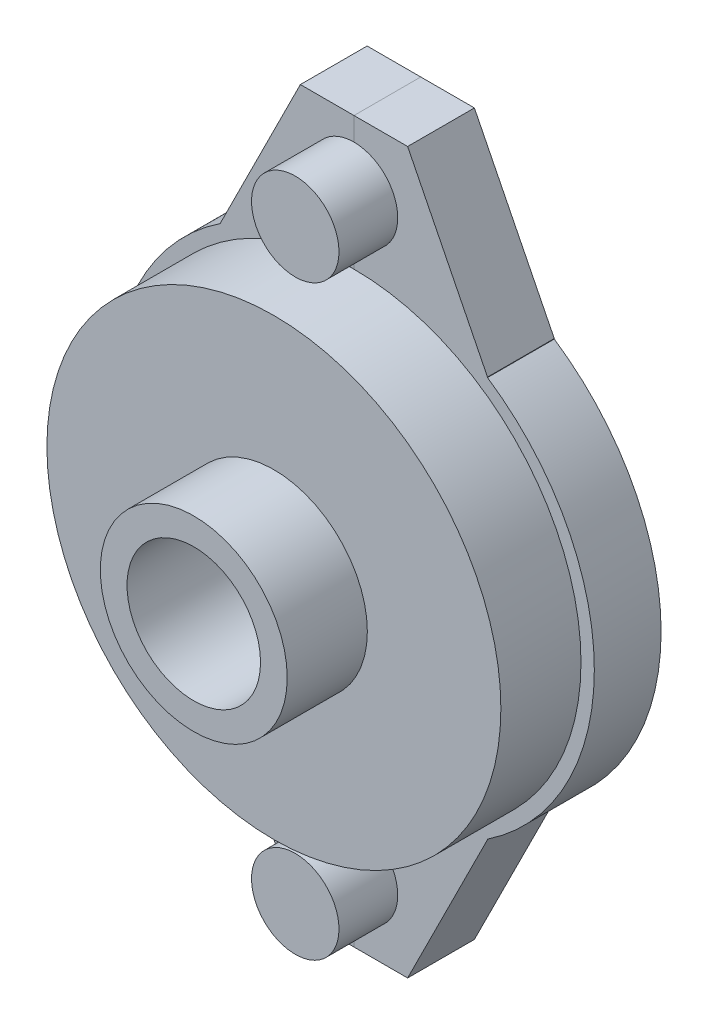
ISO-10303-21;
HEADER;
FILE_DESCRIPTION(('STEP AP214'),'2;1');
FILE_NAME('part.step','',(''),(''),'','','');
FILE_SCHEMA(('AUTOMOTIVE_DESIGN { 1 0 10303 214 1 1 1 1 }'));
ENDSEC;
DATA;
#1=APPLICATION_CONTEXT('core data for automotive mechanical design processes');
#2=APPLICATION_PROTOCOL_DEFINITION('international standard','automotive_design',2000,#1);
#3=PRODUCT_CONTEXT('',#1,'mechanical');
#4=PRODUCT('Part','Part','',(#3));
#5=PRODUCT_RELATED_PRODUCT_CATEGORY('part','',(#4));
#6=PRODUCT_DEFINITION_FORMATION('','',#4);
#7=PRODUCT_DEFINITION_CONTEXT('part definition',#1,'design');
#8=PRODUCT_DEFINITION('design','',#6,#7);
#9=PRODUCT_DEFINITION_SHAPE('','',#8);
#10=(LENGTH_UNIT() NAMED_UNIT(*) SI_UNIT(.MILLI.,.METRE.));
#11=(NAMED_UNIT(*) PLANE_ANGLE_UNIT() SI_UNIT($,.RADIAN.));
#12=(NAMED_UNIT(*) SI_UNIT($,.STERADIAN.) SOLID_ANGLE_UNIT());
#13=UNCERTAINTY_MEASURE_WITH_UNIT(LENGTH_MEASURE(1.E-05),#10,'distance_accuracy_value','');
#14=(GEOMETRIC_REPRESENTATION_CONTEXT(3) GLOBAL_UNCERTAINTY_ASSIGNED_CONTEXT((#13)) GLOBAL_UNIT_ASSIGNED_CONTEXT((#10,
#11,#12)) REPRESENTATION_CONTEXT('',''));
#15=CARTESIAN_POINT('',(0.,0.,0.));
#16=DIRECTION('',(0.,0.,1.));
#17=DIRECTION('',(1.,0.,0.));
#18=AXIS2_PLACEMENT_3D('',#15,#16,#17);
#19=CARTESIAN_POINT('',(10.,26.9666295470958,0.));
#20=DIRECTION('',(0.,1.,0.));
#21=DIRECTION('',(0.,0.,1.));
#22=AXIS2_PLACEMENT_3D('',#19,#20,#21);
#23=PLANE('',#22);
#24=DIRECTION('',(1.,0.,0.));
#25=VECTOR('',#24,1.);
#26=CARTESIAN_POINT('',(10.,26.9666295470958,0.));
#27=LINE('',#26,#25);
#28=CARTESIAN_POINT('',(-4.01668522645212,26.9666295470958,0.));
#29=VERTEX_POINT('',#28);
#30=CARTESIAN_POINT('',(0.,26.9666295470958,0.));
#31=VERTEX_POINT('',#30);
#32=EDGE_CURVE('E249',#29,#31,#27,.T.);
#33=ORIENTED_EDGE('',*,*,#32,.T.);
#34=DIRECTION('',(0.,0.,-1.));
#35=VECTOR('',#34,1.);
#36=CARTESIAN_POINT('',(0.,26.9666295470958,0.));
#37=LINE('',#36,#35);
#38=CARTESIAN_POINT('',(0.,26.9666295470958,-5.));
#39=VERTEX_POINT('',#38);
#40=EDGE_CURVE('E12',#31,#39,#37,.T.);
#41=ORIENTED_EDGE('',*,*,#40,.T.);
#42=DIRECTION('',(1.,0.,0.));
#43=VECTOR('',#42,1.);
#44=CARTESIAN_POINT('',(10.,26.9666295470958,-5.));
#45=LINE('',#44,#43);
#46=CARTESIAN_POINT('',(-4.01668522645211,26.9666295470958,-5.));
#47=VERTEX_POINT('',#46);
#48=EDGE_CURVE('E260',#47,#39,#45,.T.);
#49=ORIENTED_EDGE('',*,*,#48,.F.);
#50=DIRECTION('',(0.,0.,-1.));
#51=VECTOR('',#50,1.);
#52=CARTESIAN_POINT('',(-4.01668522645211,26.9666295470958,0.));
#53=LINE('',#52,#51);
#54=EDGE_CURVE('E226',#29,#47,#53,.T.);
#55=ORIENTED_EDGE('',*,*,#54,.F.);
#56=EDGE_LOOP('',(#33,#41,#49,#55));
#57=FACE_BOUND('',#56,.T.);
#58=ADVANCED_FACE('F45',(#57),#23,.T.);
#59=CARTESIAN_POINT('',(10.,-26.9666295470958,0.));
#60=DIRECTION('',(0.,1.,0.));
#61=DIRECTION('',(0.,0.,1.));
#62=AXIS2_PLACEMENT_3D('',#59,#60,#61);
#63=PLANE('',#62);
#64=DIRECTION('',(1.,0.,0.));
#65=VECTOR('',#64,1.);
#66=CARTESIAN_POINT('',(10.,-26.9666295470958,0.));
#67=LINE('',#66,#65);
#68=CARTESIAN_POINT('',(0.,-26.9666295470958,0.));
#69=VERTEX_POINT('',#68);
#70=CARTESIAN_POINT('',(4.01668522645212,-26.9666295470958,0.));
#71=VERTEX_POINT('',#70);
#72=EDGE_CURVE('E200',#69,#71,#67,.T.);
#73=ORIENTED_EDGE('',*,*,#72,.F.);
#74=DIRECTION('',(0.,0.,-1.));
#75=VECTOR('',#74,1.);
#76=CARTESIAN_POINT('',(0.,-26.9666295470958,0.));
#77=LINE('',#76,#75);
#78=CARTESIAN_POINT('',(0.,-26.9666295470958,-5.));
#79=VERTEX_POINT('',#78);
#80=EDGE_CURVE('E54',#69,#79,#77,.T.);
#81=ORIENTED_EDGE('',*,*,#80,.T.);
#82=DIRECTION('',(1.,0.,0.));
#83=VECTOR('',#82,1.);
#84=CARTESIAN_POINT('',(10.,-26.9666295470958,-5.));
#85=LINE('',#84,#83);
#86=CARTESIAN_POINT('',(4.01668522645212,-26.9666295470958,-5.));
#87=VERTEX_POINT('',#86);
#88=EDGE_CURVE('E207',#79,#87,#85,.T.);
#89=ORIENTED_EDGE('',*,*,#88,.T.);
#90=DIRECTION('',(0.,0.,-1.));
#91=VECTOR('',#90,1.);
#92=CARTESIAN_POINT('',(4.01668522645212,-26.9666295470958,0.));
#93=LINE('',#92,#91);
#94=EDGE_CURVE('E185',#71,#87,#93,.T.);
#95=ORIENTED_EDGE('',*,*,#94,.F.);
#96=EDGE_LOOP('',(#73,#81,#89,#95));
#97=FACE_BOUND('',#96,.T.);
#98=ADVANCED_FACE('F383',(#97),#63,.F.);
#99=CARTESIAN_POINT('',(0.,0.,0.));
#100=DIRECTION('',(0.,0.,-1.));
#101=DIRECTION('',(-1.,0.,0.));
#102=AXIS2_PLACEMENT_3D('',#99,#100,#101);
#103=PLANE('',#102);
#104=CARTESIAN_POINT('',(0.,-21.9666295470958,0.));
#105=DIRECTION('',(0.,0.,-1.));
#106=DIRECTION('',(1.,0.,0.));
#107=AXIS2_PLACEMENT_3D('',#104,#105,#106);
#108=CIRCLE('',#107,3.275);
#109=CARTESIAN_POINT('',(0.,-18.6916295470958,0.));
#110=VERTEX_POINT('',#109);
#111=CARTESIAN_POINT('',(0.,-25.2416295470958,0.));
#112=VERTEX_POINT('',#111);
#113=EDGE_CURVE('E499',#110,#112,#108,.T.);
#114=ORIENTED_EDGE('',*,*,#113,.T.);
#115=DIRECTION('',(0.,-1.,0.));
#116=VECTOR('',#115,1.);
#117=CARTESIAN_POINT('',(0.,0.,0.));
#118=LINE('',#117,#116);
#119=EDGE_CURVE('E328',#112,#69,#118,.T.);
#120=ORIENTED_EDGE('',*,*,#119,.T.);
#121=ORIENTED_EDGE('',*,*,#72,.T.);
#122=DIRECTION('',(0.447213595499958,0.894427190999916,0.));
#123=VECTOR('',#122,1.);
#124=CARTESIAN_POINT('',(10.,-15.,0.));
#125=LINE('',#124,#123);
#126=CARTESIAN_POINT('',(10.,-15.,0.));
#127=VERTEX_POINT('',#126);
#128=EDGE_CURVE('E174',#71,#127,#125,.T.);
#129=ORIENTED_EDGE('',*,*,#128,.T.);
#130=DIRECTION('',(0.,1.,0.));
#131=VECTOR('',#130,1.);
#132=CARTESIAN_POINT('',(10.,-14.9666295470958,0.));
#133=LINE('',#132,#131);
#134=CARTESIAN_POINT('',(10.,-14.9666295470958,0.));
#135=VERTEX_POINT('',#134);
#136=EDGE_CURVE('E215',#127,#135,#133,.T.);
#137=ORIENTED_EDGE('',*,*,#136,.T.);
#138=CARTESIAN_POINT('',(0.,0.,0.));
#139=DIRECTION('',(0.,0.,-1.));
#140=DIRECTION('',(-1.,0.,0.));
#141=AXIS2_PLACEMENT_3D('',#138,#139,#140);
#142=CIRCLE('',#141,18.);
#143=CARTESIAN_POINT('',(10.,14.9666295470958,0.));
#144=VERTEX_POINT('',#143);
#145=EDGE_CURVE('E279',#144,#135,#142,.T.);
#146=ORIENTED_EDGE('',*,*,#145,.F.);
#147=DIRECTION('',(0.,-1.,0.));
#148=VECTOR('',#147,1.);
#149=CARTESIAN_POINT('',(10.,14.9666295470958,0.));
#150=LINE('',#149,#148);
#151=CARTESIAN_POINT('',(10.,15.,0.));
#152=VERTEX_POINT('',#151);
#153=EDGE_CURVE('E252',#152,#144,#150,.T.);
#154=ORIENTED_EDGE('',*,*,#153,.F.);
#155=DIRECTION('',(0.447213595499958,-0.894427190999916,0.));
#156=VECTOR('',#155,1.);
#157=CARTESIAN_POINT('',(10.,15.,0.));
#158=LINE('',#157,#156);
#159=CARTESIAN_POINT('',(4.01668522645212,26.9666295470958,0.));
#160=VERTEX_POINT('',#159);
#161=EDGE_CURVE('E227',#160,#152,#158,.T.);
#162=ORIENTED_EDGE('',*,*,#161,.F.);
#163=EDGE_CURVE('E247',#31,#160,#27,.T.);
#164=ORIENTED_EDGE('',*,*,#163,.F.);
#165=DIRECTION('',(0.,-1.,0.));
#166=VECTOR('',#165,1.);
#167=CARTESIAN_POINT('',(0.,0.,0.));
#168=LINE('',#167,#166);
#169=CARTESIAN_POINT('',(0.,25.2416295470958,0.));
#170=VERTEX_POINT('',#169);
#171=EDGE_CURVE('E316',#31,#170,#168,.T.);
#172=ORIENTED_EDGE('',*,*,#171,.T.);
#173=CARTESIAN_POINT('',(0.,21.9666295470958,0.));
#174=DIRECTION('',(0.,0.,-1.));
#175=DIRECTION('',(-1.,0.,0.));
#176=AXIS2_PLACEMENT_3D('',#173,#174,#175);
#177=CIRCLE('',#176,3.275);
#178=CARTESIAN_POINT('',(0.,18.6916295470958,0.));
#179=VERTEX_POINT('',#178);
#180=EDGE_CURVE('E306',#179,#170,#177,.F.);
#181=ORIENTED_EDGE('',*,*,#180,.F.);
#182=DIRECTION('',(0.,-1.,0.));
#183=VECTOR('',#182,1.);
#184=CARTESIAN_POINT('',(0.,0.,0.));
#185=LINE('',#184,#183);
#186=CARTESIAN_POINT('',(0.,17.,0.));
#187=VERTEX_POINT('',#186);
#188=EDGE_CURVE('E320',#179,#187,#185,.T.);
#189=ORIENTED_EDGE('',*,*,#188,.T.);
#190=CARTESIAN_POINT('',(0.,0.,0.));
#191=DIRECTION('',(0.,0.,1.));
#192=DIRECTION('',(1.,0.,0.));
#193=AXIS2_PLACEMENT_3D('',#190,#191,#192);
#194=CIRCLE('',#193,17.);
#195=CARTESIAN_POINT('',(0.,-17.,0.));
#196=VERTEX_POINT('',#195);
#197=EDGE_CURVE('E277',#196,#187,#194,.T.);
#198=ORIENTED_EDGE('',*,*,#197,.F.);
#199=DIRECTION('',(0.,-1.,0.));
#200=VECTOR('',#199,1.);
#201=CARTESIAN_POINT('',(0.,0.,0.));
#202=LINE('',#201,#200);
#203=EDGE_CURVE('E324',#196,#110,#202,.T.);
#204=ORIENTED_EDGE('',*,*,#203,.T.);
#205=EDGE_LOOP('',(#114,#120,#121,#129,#137,#146,#154,#162,#164,#172,#181,#189,#198,#204));
#206=FACE_BOUND('',#205,.T.);
#207=ADVANCED_FACE('F354',(#206),#103,.F.);
#208=CARTESIAN_POINT('',(0.,0.,-5.));
#209=DIRECTION('',(0.,0.,1.));
#210=DIRECTION('',(1.,0.,0.));
#211=AXIS2_PLACEMENT_3D('',#208,#209,#210);
#212=CYLINDRICAL_SURFACE('',#211,5.);
#213=CARTESIAN_POINT('',(0.,0.,12.));
#214=DIRECTION('',(0.,0.,1.));
#215=DIRECTION('',(1.,0.,0.));
#216=AXIS2_PLACEMENT_3D('',#213,#214,#215);
#217=CIRCLE('',#216,5.);
#218=CARTESIAN_POINT('',(5.,0.,12.));
#219=VERTEX_POINT('',#218);
#220=EDGE_CURVE('E487',#219,#219,#217,.T.);
#221=ORIENTED_EDGE('',*,*,#220,.T.);
#222=EDGE_LOOP('',(#221));
#223=FACE_BOUND('',#222,.T.);
#224=CARTESIAN_POINT('',(0.,0.,-2.2));
#225=DIRECTION('',(0.,0.,-1.));
#226=DIRECTION('',(-1.,0.,0.));
#227=AXIS2_PLACEMENT_3D('',#224,#225,#226);
#228=CIRCLE('',#227,5.);
#229=CARTESIAN_POINT('',(-5.,0.,-2.2));
#230=VERTEX_POINT('',#229);
#231=EDGE_CURVE('E471',#230,#230,#228,.F.);
#232=ORIENTED_EDGE('',*,*,#231,.F.);
#233=EDGE_LOOP('',(#232));
#234=FACE_BOUND('',#233,.T.);
#235=ADVANCED_FACE('F444',(#223,#234),#212,.F.);
#236=CARTESIAN_POINT('',(0.,0.,-2.));
#237=DIRECTION('',(0.,0.,-1.));
#238=DIRECTION('',(-1.,0.,0.));
#239=AXIS2_PLACEMENT_3D('',#236,#237,#238);
#240=CYLINDRICAL_SURFACE('',#239,8.6);
#241=CARTESIAN_POINT('',(0.,0.,-2.));
#242=DIRECTION('',(0.,0.,-1.));
#243=DIRECTION('',(-1.,0.,0.));
#244=AXIS2_PLACEMENT_3D('',#241,#242,#243);
#245=CIRCLE('',#244,8.6);
#246=CARTESIAN_POINT('',(-8.6,0.,-2.));
#247=VERTEX_POINT('',#246);
#248=EDGE_CURVE('E474',#247,#247,#245,.T.);
#249=ORIENTED_EDGE('',*,*,#248,.T.);
#250=EDGE_LOOP('',(#249));
#251=FACE_BOUND('',#250,.T.);
#252=CARTESIAN_POINT('',(0.,0.,-2.2));
#253=DIRECTION('',(0.,0.,-1.));
#254=DIRECTION('',(-1.,0.,0.));
#255=AXIS2_PLACEMENT_3D('',#252,#253,#254);
#256=CIRCLE('',#255,8.6);
#257=CARTESIAN_POINT('',(-8.6,0.,-2.2));
#258=VERTEX_POINT('',#257);
#259=EDGE_CURVE('E468',#258,#258,#256,.T.);
#260=ORIENTED_EDGE('',*,*,#259,.F.);
#261=EDGE_LOOP('',(#260));
#262=FACE_BOUND('',#261,.T.);
#263=ADVANCED_FACE('F447',(#251,#262),#240,.T.);
#264=CARTESIAN_POINT('',(0.,0.,-5.));
#265=DIRECTION('',(0.,0.,-1.));
#266=DIRECTION('',(-1.,0.,0.));
#267=AXIS2_PLACEMENT_3D('',#264,#265,#266);
#268=PLANE('',#267);
#269=CARTESIAN_POINT('',(0.,0.,-5.));
#270=DIRECTION('',(0.,0.,-1.));
#271=DIRECTION('',(-1.,0.,0.));
#272=AXIS2_PLACEMENT_3D('',#269,#270,#271);
#273=CIRCLE('',#272,13.6);
#274=CARTESIAN_POINT('',(-13.6,0.,-5.));
#275=VERTEX_POINT('',#274);
#276=EDGE_CURVE('E479',#275,#275,#273,.T.);
#277=ORIENTED_EDGE('',*,*,#276,.F.);
#278=EDGE_LOOP('',(#277));
#279=FACE_BOUND('',#278,.T.);
#280=CARTESIAN_POINT('',(-4.01668522645211,-26.9666295470958,-5.));
#281=VERTEX_POINT('',#280);
#282=EDGE_CURVE('E209',#281,#79,#85,.T.);
#283=ORIENTED_EDGE('',*,*,#282,.F.);
#284=DIRECTION('',(-0.447213595499958,0.894427190999916,0.));
#285=VECTOR('',#284,1.);
#286=CARTESIAN_POINT('',(-14.,-7.,-5.));
#287=LINE('',#286,#285);
#288=CARTESIAN_POINT('',(-10.,-15.,-5.));
#289=VERTEX_POINT('',#288);
#290=EDGE_CURVE('E208',#281,#289,#287,.T.);
#291=ORIENTED_EDGE('',*,*,#290,.T.);
#292=DIRECTION('',(0.,-1.,0.));
#293=VECTOR('',#292,1.);
#294=CARTESIAN_POINT('',(-10.,-26.9666295470958,-5.));
#295=LINE('',#294,#293);
#296=CARTESIAN_POINT('',(-10.,-14.9666295470958,-5.));
#297=VERTEX_POINT('',#296);
#298=EDGE_CURVE('E183',#297,#289,#295,.T.);
#299=ORIENTED_EDGE('',*,*,#298,.F.);
#300=CARTESIAN_POINT('',(0.,0.,-5.));
#301=DIRECTION('',(0.,0.,-1.));
#302=DIRECTION('',(-1.,0.,0.));
#303=AXIS2_PLACEMENT_3D('',#300,#301,#302);
#304=CIRCLE('',#303,18.);
#305=CARTESIAN_POINT('',(-10.,14.9666295470958,-5.));
#306=VERTEX_POINT('',#305);
#307=EDGE_CURVE('E278',#297,#306,#304,.T.);
#308=ORIENTED_EDGE('',*,*,#307,.T.);
#309=DIRECTION('',(0.,1.,0.));
#310=VECTOR('',#309,1.);
#311=CARTESIAN_POINT('',(-10.,26.9666295470958,-5.));
#312=LINE('',#311,#310);
#313=CARTESIAN_POINT('',(-10.,15.,-5.));
#314=VERTEX_POINT('',#313);
#315=EDGE_CURVE('E242',#306,#314,#312,.T.);
#316=ORIENTED_EDGE('',*,*,#315,.T.);
#317=DIRECTION('',(-0.447213595499958,-0.894427190999916,0.));
#318=VECTOR('',#317,1.);
#319=CARTESIAN_POINT('',(-14.,7.,-5.));
#320=LINE('',#319,#318);
#321=EDGE_CURVE('E235',#47,#314,#320,.T.);
#322=ORIENTED_EDGE('',*,*,#321,.F.);
#323=ORIENTED_EDGE('',*,*,#48,.T.);
#324=CARTESIAN_POINT('',(4.01668522645212,26.9666295470958,-5.));
#325=VERTEX_POINT('',#324);
#326=EDGE_CURVE('E259',#39,#325,#45,.T.);
#327=ORIENTED_EDGE('',*,*,#326,.T.);
#328=DIRECTION('',(-0.447213595499958,0.894427190999916,0.));
#329=VECTOR('',#328,1.);
#330=CARTESIAN_POINT('',(14.,7.,-5.));
#331=LINE('',#330,#329);
#332=CARTESIAN_POINT('',(10.,15.,-5.));
#333=VERTEX_POINT('',#332);
#334=EDGE_CURVE('E238',#333,#325,#331,.T.);
#335=ORIENTED_EDGE('',*,*,#334,.F.);
#336=DIRECTION('',(0.,-1.,0.));
#337=VECTOR('',#336,1.);
#338=CARTESIAN_POINT('',(10.,14.9666295470958,-5.));
#339=LINE('',#338,#337);
#340=CARTESIAN_POINT('',(10.,14.9666295470958,-5.));
#341=VERTEX_POINT('',#340);
#342=EDGE_CURVE('E248',#333,#341,#339,.T.);
#343=ORIENTED_EDGE('',*,*,#342,.T.);
#344=CARTESIAN_POINT('',(10.,-14.9666295470958,-5.));
#345=VERTEX_POINT('',#344);
#346=EDGE_CURVE('E273',#341,#345,#304,.T.);
#347=ORIENTED_EDGE('',*,*,#346,.T.);
#348=DIRECTION('',(0.,1.,0.));
#349=VECTOR('',#348,1.);
#350=CARTESIAN_POINT('',(10.,-14.9666295470958,-5.));
#351=LINE('',#350,#349);
#352=CARTESIAN_POINT('',(10.,-15.,-5.));
#353=VERTEX_POINT('',#352);
#354=EDGE_CURVE('E204',#353,#345,#351,.T.);
#355=ORIENTED_EDGE('',*,*,#354,.F.);
#356=DIRECTION('',(-0.447213595499958,-0.894427190999916,0.));
#357=VECTOR('',#356,1.);
#358=CARTESIAN_POINT('',(14.,-7.,-5.));
#359=LINE('',#358,#357);
#360=EDGE_CURVE('E508',#353,#87,#359,.T.);
#361=ORIENTED_EDGE('',*,*,#360,.T.);
#362=ORIENTED_EDGE('',*,*,#88,.F.);
#363=EDGE_LOOP('',(#283,#291,#299,#308,#316,#322,#323,#327,#335,#343,#347,#355,#361,#362));
#364=FACE_BOUND('',#363,.T.);
#365=ADVANCED_FACE('F341',(#279,#364),#268,.T.);
#366=ORIENTED_EDGE('',*,*,#119,.F.);
#367=EDGE_CURVE('E494',#112,#110,#108,.T.);
#368=ORIENTED_EDGE('',*,*,#367,.T.);
#369=ORIENTED_EDGE('',*,*,#203,.F.);
#370=EDGE_CURVE('E288',#187,#196,#194,.T.);
#371=ORIENTED_EDGE('',*,*,#370,.F.);
#372=ORIENTED_EDGE('',*,*,#188,.F.);
#373=EDGE_CURVE('E307',#170,#179,#177,.F.);
#374=ORIENTED_EDGE('',*,*,#373,.F.);
#375=ORIENTED_EDGE('',*,*,#171,.F.);
#376=ORIENTED_EDGE('',*,*,#32,.F.);
#377=DIRECTION('',(0.447213595499958,0.894427190999916,0.));
#378=VECTOR('',#377,1.);
#379=CARTESIAN_POINT('',(-10.,15.,0.));
#380=LINE('',#379,#378);
#381=CARTESIAN_POINT('',(-10.,15.,0.));
#382=VERTEX_POINT('',#381);
#383=EDGE_CURVE('E223',#382,#29,#380,.T.);
#384=ORIENTED_EDGE('',*,*,#383,.F.);
#385=DIRECTION('',(0.,1.,0.));
#386=VECTOR('',#385,1.);
#387=CARTESIAN_POINT('',(-10.,26.9666295470958,0.));
#388=LINE('',#387,#386);
#389=CARTESIAN_POINT('',(-10.,14.9666295470958,0.));
#390=VERTEX_POINT('',#389);
#391=EDGE_CURVE('E243',#390,#382,#388,.T.);
#392=ORIENTED_EDGE('',*,*,#391,.F.);
#393=CARTESIAN_POINT('',(-10.,-14.9666295470958,0.));
#394=VERTEX_POINT('',#393);
#395=EDGE_CURVE('E189',#394,#390,#142,.T.);
#396=ORIENTED_EDGE('',*,*,#395,.F.);
#397=DIRECTION('',(0.,-1.,0.));
#398=VECTOR('',#397,1.);
#399=CARTESIAN_POINT('',(-10.,-26.9666295470958,0.));
#400=LINE('',#399,#398);
#401=CARTESIAN_POINT('',(-10.,-15.,0.));
#402=VERTEX_POINT('',#401);
#403=EDGE_CURVE('E181',#394,#402,#400,.T.);
#404=ORIENTED_EDGE('',*,*,#403,.T.);
#405=DIRECTION('',(0.447213595499958,-0.894427190999916,0.));
#406=VECTOR('',#405,1.);
#407=CARTESIAN_POINT('',(-10.,-15.,0.));
#408=LINE('',#407,#406);
#409=CARTESIAN_POINT('',(-4.01668522645212,-26.9666295470958,0.));
#410=VERTEX_POINT('',#409);
#411=EDGE_CURVE('E162',#402,#410,#408,.T.);
#412=ORIENTED_EDGE('',*,*,#411,.T.);
#413=EDGE_CURVE('E193',#410,#69,#67,.T.);
#414=ORIENTED_EDGE('',*,*,#413,.T.);
#415=EDGE_LOOP('',(#366,#368,#369,#371,#372,#374,#375,#376,#384,#392,#396,#404,#412,#414));
#416=FACE_BOUND('',#415,.T.);
#417=ADVANCED_FACE('F187',(#416),#103,.F.);
#418=CARTESIAN_POINT('',(-10.,-26.9666295470958,0.));
#419=DIRECTION('',(1.,0.,0.));
#420=DIRECTION('',(0.,0.,-1.));
#421=AXIS2_PLACEMENT_3D('',#418,#419,#420);
#422=PLANE('',#421);
#423=DIRECTION('',(0.,0.,1.));
#424=VECTOR('',#423,1.);
#425=CARTESIAN_POINT('',(-10.,-15.,-8.));
#426=LINE('',#425,#424);
#427=EDGE_CURVE('E165',#289,#402,#426,.T.);
#428=ORIENTED_EDGE('',*,*,#427,.T.);
#429=ORIENTED_EDGE('',*,*,#403,.F.);
#430=DIRECTION('',(0.,0.,-1.));
#431=VECTOR('',#430,1.);
#432=CARTESIAN_POINT('',(-10.,-14.9666295470958,0.));
#433=LINE('',#432,#431);
#434=EDGE_CURVE('E198',#394,#297,#433,.T.);
#435=ORIENTED_EDGE('',*,*,#434,.T.);
#436=ORIENTED_EDGE('',*,*,#298,.T.);
#437=EDGE_LOOP('',(#428,#429,#435,#436));
#438=FACE_BOUND('',#437,.T.);
#439=ADVANCED_FACE('F179',(#438),#422,.F.);
#440=ORIENTED_EDGE('',*,*,#80,.F.);
#441=ORIENTED_EDGE('',*,*,#413,.F.);
#442=DIRECTION('',(0.,0.,1.));
#443=VECTOR('',#442,1.);
#444=CARTESIAN_POINT('',(-4.01668522645211,-26.9666295470958,0.));
#445=LINE('',#444,#443);
#446=EDGE_CURVE('E168',#281,#410,#445,.T.);
#447=ORIENTED_EDGE('',*,*,#446,.F.);
#448=ORIENTED_EDGE('',*,*,#282,.T.);
#449=EDGE_LOOP('',(#440,#441,#447,#448));
#450=FACE_BOUND('',#449,.T.);
#451=ADVANCED_FACE('F390',(#450),#63,.F.);
#452=CARTESIAN_POINT('',(10.,-14.9666295470958,0.));
#453=DIRECTION('',(-1.,0.,0.));
#454=DIRECTION('',(0.,0.,1.));
#455=AXIS2_PLACEMENT_3D('',#452,#453,#454);
#456=PLANE('',#455);
#457=DIRECTION('',(0.,0.,1.));
#458=VECTOR('',#457,1.);
#459=CARTESIAN_POINT('',(10.,-15.,0.));
#460=LINE('',#459,#458);
#461=EDGE_CURVE('E311',#353,#127,#460,.T.);
#462=ORIENTED_EDGE('',*,*,#461,.F.);
#463=ORIENTED_EDGE('',*,*,#354,.T.);
#464=DIRECTION('',(0.,0.,-1.));
#465=VECTOR('',#464,1.);
#466=CARTESIAN_POINT('',(10.,-14.9666295470958,0.));
#467=LINE('',#466,#465);
#468=EDGE_CURVE('E192',#135,#345,#467,.T.);
#469=ORIENTED_EDGE('',*,*,#468,.F.);
#470=ORIENTED_EDGE('',*,*,#136,.F.);
#471=EDGE_LOOP('',(#462,#463,#469,#470));
#472=FACE_BOUND('',#471,.T.);
#473=ADVANCED_FACE('F423',(#472),#456,.F.);
#474=CARTESIAN_POINT('',(0.,0.,-5.));
#475=DIRECTION('',(0.,0.,1.));
#476=DIRECTION('',(1.,0.,0.));
#477=AXIS2_PLACEMENT_3D('',#474,#475,#476);
#478=CYLINDRICAL_SURFACE('',#477,18.);
#479=ORIENTED_EDGE('',*,*,#434,.F.);
#480=ORIENTED_EDGE('',*,*,#395,.T.);
#481=DIRECTION('',(0.,0.,-1.));
#482=VECTOR('',#481,1.);
#483=CARTESIAN_POINT('',(-10.,14.9666295470958,0.));
#484=LINE('',#483,#482);
#485=EDGE_CURVE('E255',#390,#306,#484,.T.);
#486=ORIENTED_EDGE('',*,*,#485,.T.);
#487=ORIENTED_EDGE('',*,*,#307,.F.);
#488=EDGE_LOOP('',(#479,#480,#486,#487));
#489=FACE_BOUND('',#488,.T.);
#490=ADVANCED_FACE('F378',(#489),#478,.T.);
#491=ORIENTED_EDGE('',*,*,#468,.T.);
#492=ORIENTED_EDGE('',*,*,#346,.F.);
#493=DIRECTION('',(0.,0.,-1.));
#494=VECTOR('',#493,1.);
#495=CARTESIAN_POINT('',(10.,14.9666295470958,0.));
#496=LINE('',#495,#494);
#497=EDGE_CURVE('E266',#144,#341,#496,.T.);
#498=ORIENTED_EDGE('',*,*,#497,.F.);
#499=ORIENTED_EDGE('',*,*,#145,.T.);
#500=EDGE_LOOP('',(#491,#492,#498,#499));
#501=FACE_BOUND('',#500,.T.);
#502=ADVANCED_FACE('F368',(#501),#478,.T.);
#503=CARTESIAN_POINT('',(0.,0.,6.));
#504=DIRECTION('',(0.,0.,-1.));
#505=DIRECTION('',(-1.,0.,0.));
#506=AXIS2_PLACEMENT_3D('',#503,#504,#505);
#507=CYLINDRICAL_SURFACE('',#506,17.);
#508=CARTESIAN_POINT('',(0.,0.,6.));
#509=DIRECTION('',(0.,0.,1.));
#510=DIRECTION('',(1.,0.,0.));
#511=AXIS2_PLACEMENT_3D('',#508,#509,#510);
#512=CIRCLE('',#511,17.);
#513=CARTESIAN_POINT('',(17.,0.,6.));
#514=VERTEX_POINT('',#513);
#515=EDGE_CURVE('E287',#514,#514,#512,.T.);
#516=ORIENTED_EDGE('',*,*,#515,.F.);
#517=EDGE_LOOP('',(#516));
#518=FACE_BOUND('',#517,.T.);
#519=ORIENTED_EDGE('',*,*,#370,.T.);
#520=ORIENTED_EDGE('',*,*,#197,.T.);
#521=EDGE_LOOP('',(#519,#520));
#522=FACE_BOUND('',#521,.T.);
#523=ADVANCED_FACE('F47',(#518,#522),#507,.T.);
#524=CARTESIAN_POINT('',(0.,0.,6.));
#525=DIRECTION('',(0.,0.,1.));
#526=DIRECTION('',(1.,0.,0.));
#527=AXIS2_PLACEMENT_3D('',#524,#525,#526);
#528=PLANE('',#527);
#529=CARTESIAN_POINT('',(0.,0.,6.));
#530=DIRECTION('',(0.,0.,1.));
#531=DIRECTION('',(1.,0.,0.));
#532=AXIS2_PLACEMENT_3D('',#529,#530,#531);
#533=CIRCLE('',#532,7.);
#534=CARTESIAN_POINT('',(7.,0.,6.));
#535=VERTEX_POINT('',#534);
#536=EDGE_CURVE('E289',#535,#535,#533,.T.);
#537=ORIENTED_EDGE('',*,*,#536,.F.);
#538=EDGE_LOOP('',(#537));
#539=FACE_BOUND('',#538,.T.);
#540=ORIENTED_EDGE('',*,*,#515,.T.);
#541=EDGE_LOOP('',(#540));
#542=FACE_BOUND('',#541,.T.);
#543=ADVANCED_FACE('F367',(#539,#542),#528,.T.);
#544=CARTESIAN_POINT('',(0.,0.,12.));
#545=DIRECTION('',(0.,0.,-1.));
#546=DIRECTION('',(-1.,0.,0.));
#547=AXIS2_PLACEMENT_3D('',#544,#545,#546);
#548=CYLINDRICAL_SURFACE('',#547,7.);
#549=CARTESIAN_POINT('',(0.,0.,12.));
#550=DIRECTION('',(0.,0.,1.));
#551=DIRECTION('',(1.,0.,0.));
#552=AXIS2_PLACEMENT_3D('',#549,#550,#551);
#553=CIRCLE('',#552,7.);
#554=CARTESIAN_POINT('',(7.,0.,12.));
#555=VERTEX_POINT('',#554);
#556=EDGE_CURVE('E283',#555,#555,#553,.T.);
#557=ORIENTED_EDGE('',*,*,#556,.F.);
#558=EDGE_LOOP('',(#557));
#559=FACE_BOUND('',#558,.T.);
#560=ORIENTED_EDGE('',*,*,#536,.T.);
#561=EDGE_LOOP('',(#560));
#562=FACE_BOUND('',#561,.T.);
#563=ADVANCED_FACE('F375',(#559,#562),#548,.T.);
#564=CARTESIAN_POINT('',(0.,0.,12.));
#565=DIRECTION('',(0.,0.,1.));
#566=DIRECTION('',(1.,0.,0.));
#567=AXIS2_PLACEMENT_3D('',#564,#565,#566);
#568=PLANE('',#567);
#569=ORIENTED_EDGE('',*,*,#220,.F.);
#570=EDGE_LOOP('',(#569));
#571=FACE_BOUND('',#570,.T.);
#572=ORIENTED_EDGE('',*,*,#556,.T.);
#573=EDGE_LOOP('',(#572));
#574=FACE_BOUND('',#573,.T.);
#575=ADVANCED_FACE('F402',(#571,#574),#568,.T.);
#576=CARTESIAN_POINT('',(10.,14.9666295470958,0.));
#577=DIRECTION('',(1.,0.,0.));
#578=DIRECTION('',(0.,0.,-1.));
#579=AXIS2_PLACEMENT_3D('',#576,#577,#578);
#580=PLANE('',#579);
#581=DIRECTION('',(0.,0.,1.));
#582=VECTOR('',#581,1.);
#583=CARTESIAN_POINT('',(10.,15.,-8.));
#584=LINE('',#583,#582);
#585=EDGE_CURVE('E222',#333,#152,#584,.T.);
#586=ORIENTED_EDGE('',*,*,#585,.T.);
#587=ORIENTED_EDGE('',*,*,#153,.T.);
#588=ORIENTED_EDGE('',*,*,#497,.T.);
#589=ORIENTED_EDGE('',*,*,#342,.F.);
#590=EDGE_LOOP('',(#586,#587,#588,#589));
#591=FACE_BOUND('',#590,.T.);
#592=ADVANCED_FACE('F394',(#591),#580,.T.);
#593=ORIENTED_EDGE('',*,*,#40,.F.);
#594=ORIENTED_EDGE('',*,*,#163,.T.);
#595=DIRECTION('',(0.,0.,1.));
#596=VECTOR('',#595,1.);
#597=CARTESIAN_POINT('',(4.01668522645212,26.9666295470958,0.));
#598=LINE('',#597,#596);
#599=EDGE_CURVE('E302',#325,#160,#598,.T.);
#600=ORIENTED_EDGE('',*,*,#599,.F.);
#601=ORIENTED_EDGE('',*,*,#326,.F.);
#602=EDGE_LOOP('',(#593,#594,#600,#601));
#603=FACE_BOUND('',#602,.T.);
#604=ADVANCED_FACE('F349',(#603),#23,.T.);
#605=CARTESIAN_POINT('',(-10.,26.9666295470958,0.));
#606=DIRECTION('',(-1.,0.,0.));
#607=DIRECTION('',(0.,0.,1.));
#608=AXIS2_PLACEMENT_3D('',#605,#606,#607);
#609=PLANE('',#608);
#610=DIRECTION('',(0.,0.,1.));
#611=VECTOR('',#610,1.);
#612=CARTESIAN_POINT('',(-10.,15.,0.));
#613=LINE('',#612,#611);
#614=EDGE_CURVE('E293',#314,#382,#613,.T.);
#615=ORIENTED_EDGE('',*,*,#614,.F.);
#616=ORIENTED_EDGE('',*,*,#315,.F.);
#617=ORIENTED_EDGE('',*,*,#485,.F.);
#618=ORIENTED_EDGE('',*,*,#391,.T.);
#619=EDGE_LOOP('',(#615,#616,#617,#618));
#620=FACE_BOUND('',#619,.T.);
#621=ADVANCED_FACE('F393',(#620),#609,.T.);
#622=CARTESIAN_POINT('',(-10.,15.,-8.));
#623=DIRECTION('',(0.894427190999916,-0.447213595499958,0.));
#624=DIRECTION('',(0.447213595499958,0.894427190999916,0.));
#625=AXIS2_PLACEMENT_3D('',#622,#623,#624);
#626=PLANE('',#625);
#627=ORIENTED_EDGE('',*,*,#321,.T.);
#628=ORIENTED_EDGE('',*,*,#614,.T.);
#629=ORIENTED_EDGE('',*,*,#383,.T.);
#630=ORIENTED_EDGE('',*,*,#54,.T.);
#631=EDGE_LOOP('',(#627,#628,#629,#630));
#632=FACE_BOUND('',#631,.T.);
#633=ADVANCED_FACE('F399',(#632),#626,.F.);
#634=CARTESIAN_POINT('',(10.,15.,-8.));
#635=DIRECTION('',(-0.894427190999916,-0.447213595499958,0.));
#636=DIRECTION('',(0.447213595499958,-0.894427190999916,0.));
#637=AXIS2_PLACEMENT_3D('',#634,#635,#636);
#638=PLANE('',#637);
#639=ORIENTED_EDGE('',*,*,#334,.T.);
#640=ORIENTED_EDGE('',*,*,#599,.T.);
#641=ORIENTED_EDGE('',*,*,#161,.T.);
#642=ORIENTED_EDGE('',*,*,#585,.F.);
#643=EDGE_LOOP('',(#639,#640,#641,#642));
#644=FACE_BOUND('',#643,.T.);
#645=ADVANCED_FACE('F347',(#644),#638,.F.);
#646=CARTESIAN_POINT('',(0.,21.9666295470958,4.4));
#647=DIRECTION('',(0.,0.,-1.));
#648=DIRECTION('',(-1.,0.,0.));
#649=AXIS2_PLACEMENT_3D('',#646,#647,#648);
#650=CYLINDRICAL_SURFACE('',#649,3.275);
#651=CARTESIAN_POINT('',(0.,21.9666295470958,4.4));
#652=DIRECTION('',(0.,0.,1.));
#653=DIRECTION('',(1.,0.,0.));
#654=AXIS2_PLACEMENT_3D('',#651,#652,#653);
#655=CIRCLE('',#654,3.275);
#656=CARTESIAN_POINT('',(3.275,21.9666295470958,4.4));
#657=VERTEX_POINT('',#656);
#658=EDGE_CURVE('E217',#657,#657,#655,.T.);
#659=ORIENTED_EDGE('',*,*,#658,.F.);
#660=EDGE_LOOP('',(#659));
#661=FACE_BOUND('',#660,.T.);
#662=ORIENTED_EDGE('',*,*,#373,.T.);
#663=ORIENTED_EDGE('',*,*,#180,.T.);
#664=EDGE_LOOP('',(#662,#663));
#665=FACE_BOUND('',#664,.T.);
#666=ADVANCED_FACE('F363',(#661,#665),#650,.T.);
#667=CARTESIAN_POINT('',(0.,21.9666295470958,4.4));
#668=DIRECTION('',(0.,0.,1.));
#669=DIRECTION('',(1.,0.,0.));
#670=AXIS2_PLACEMENT_3D('',#667,#668,#669);
#671=PLANE('',#670);
#672=ORIENTED_EDGE('',*,*,#658,.T.);
#673=EDGE_LOOP('',(#672));
#674=FACE_BOUND('',#673,.T.);
#675=ADVANCED_FACE('F417',(#674),#671,.T.);
#676=CARTESIAN_POINT('',(10.,-15.,-8.));
#677=DIRECTION('',(0.894427190999916,-0.447213595499958,0.));
#678=DIRECTION('',(0.447213595499958,0.894427190999916,0.));
#679=AXIS2_PLACEMENT_3D('',#676,#677,#678);
#680=PLANE('',#679);
#681=ORIENTED_EDGE('',*,*,#461,.T.);
#682=ORIENTED_EDGE('',*,*,#128,.F.);
#683=ORIENTED_EDGE('',*,*,#94,.T.);
#684=ORIENTED_EDGE('',*,*,#360,.F.);
#685=EDGE_LOOP('',(#681,#682,#683,#684));
#686=FACE_BOUND('',#685,.T.);
#687=ADVANCED_FACE('F421',(#686),#680,.T.);
#688=CARTESIAN_POINT('',(-10.,-15.,-8.));
#689=DIRECTION('',(-0.894427190999916,-0.447213595499958,0.));
#690=DIRECTION('',(0.447213595499958,-0.894427190999916,0.));
#691=AXIS2_PLACEMENT_3D('',#688,#689,#690);
#692=PLANE('',#691);
#693=ORIENTED_EDGE('',*,*,#446,.T.);
#694=ORIENTED_EDGE('',*,*,#411,.F.);
#695=ORIENTED_EDGE('',*,*,#427,.F.);
#696=ORIENTED_EDGE('',*,*,#290,.F.);
#697=EDGE_LOOP('',(#693,#694,#695,#696));
#698=FACE_BOUND('',#697,.T.);
#699=ADVANCED_FACE('F164',(#698),#692,.T.);
#700=CARTESIAN_POINT('',(0.,-21.9666295470958,4.4));
#701=DIRECTION('',(0.,0.,-1.));
#702=DIRECTION('',(-1.,0.,0.));
#703=AXIS2_PLACEMENT_3D('',#700,#701,#702);
#704=CYLINDRICAL_SURFACE('',#703,3.275);
#705=CARTESIAN_POINT('',(0.,-21.9666295470958,4.4));
#706=DIRECTION('',(0.,0.,-1.));
#707=DIRECTION('',(1.,0.,0.));
#708=AXIS2_PLACEMENT_3D('',#705,#706,#707);
#709=CIRCLE('',#708,3.275);
#710=CARTESIAN_POINT('',(3.275,-21.9666295470958,4.4));
#711=VERTEX_POINT('',#710);
#712=EDGE_CURVE('E495',#711,#711,#709,.T.);
#713=ORIENTED_EDGE('',*,*,#712,.T.);
#714=EDGE_LOOP('',(#713));
#715=FACE_BOUND('',#714,.T.);
#716=ORIENTED_EDGE('',*,*,#113,.F.);
#717=ORIENTED_EDGE('',*,*,#367,.F.);
#718=EDGE_LOOP('',(#716,#717));
#719=FACE_BOUND('',#718,.T.);
#720=ADVANCED_FACE('F435',(#715,#719),#704,.T.);
#721=CARTESIAN_POINT('',(0.,-21.9666295470958,4.4));
#722=DIRECTION('',(0.,0.,1.));
#723=DIRECTION('',(1.,0.,0.));
#724=AXIS2_PLACEMENT_3D('',#721,#722,#723);
#725=PLANE('',#724);
#726=ORIENTED_EDGE('',*,*,#712,.F.);
#727=EDGE_LOOP('',(#726));
#728=FACE_BOUND('',#727,.T.);
#729=ADVANCED_FACE('F438',(#728),#725,.T.);
#730=CARTESIAN_POINT('',(0.,0.,-2.));
#731=DIRECTION('',(0.,0.,-1.));
#732=DIRECTION('',(-1.,0.,0.));
#733=AXIS2_PLACEMENT_3D('',#730,#731,#732);
#734=CYLINDRICAL_SURFACE('',#733,13.6);
#735=CARTESIAN_POINT('',(0.,0.,-2.));
#736=DIRECTION('',(0.,0.,-1.));
#737=DIRECTION('',(-1.,0.,0.));
#738=AXIS2_PLACEMENT_3D('',#735,#736,#737);
#739=CIRCLE('',#738,13.6);
#740=CARTESIAN_POINT('',(-13.6,0.,-2.));
#741=VERTEX_POINT('',#740);
#742=EDGE_CURVE('E483',#741,#741,#739,.T.);
#743=ORIENTED_EDGE('',*,*,#742,.F.);
#744=EDGE_LOOP('',(#743));
#745=FACE_BOUND('',#744,.T.);
#746=ORIENTED_EDGE('',*,*,#276,.T.);
#747=EDGE_LOOP('',(#746));
#748=FACE_BOUND('',#747,.T.);
#749=ADVANCED_FACE('F442',(#745,#748),#734,.F.);
#750=CARTESIAN_POINT('',(0.,0.,-2.));
#751=DIRECTION('',(0.,0.,-1.));
#752=DIRECTION('',(-1.,0.,0.));
#753=AXIS2_PLACEMENT_3D('',#750,#751,#752);
#754=PLANE('',#753);
#755=ORIENTED_EDGE('',*,*,#248,.F.);
#756=EDGE_LOOP('',(#755));
#757=FACE_BOUND('',#756,.T.);
#758=ORIENTED_EDGE('',*,*,#742,.T.);
#759=EDGE_LOOP('',(#758));
#760=FACE_BOUND('',#759,.T.);
#761=ADVANCED_FACE('F451',(#757,#760),#754,.T.);
#762=CARTESIAN_POINT('',(0.,0.,-2.2));
#763=DIRECTION('',(0.,0.,-1.));
#764=DIRECTION('',(-1.,0.,0.));
#765=AXIS2_PLACEMENT_3D('',#762,#763,#764);
#766=PLANE('',#765);
#767=ORIENTED_EDGE('',*,*,#259,.T.);
#768=EDGE_LOOP('',(#767));
#769=FACE_BOUND('',#768,.T.);
#770=ORIENTED_EDGE('',*,*,#231,.T.);
#771=EDGE_LOOP('',(#770));
#772=FACE_BOUND('',#771,.T.);
#773=ADVANCED_FACE('F455',(#769,#772),#766,.T.);
#774=CLOSED_SHELL('',(#58,#98,#207,#235,#263,#365,#417,#439,#451,#473,#490,#502,#523,#543,#563,
#575,#592,#604,#621,#633,#645,#666,#675,#687,#699,#720,#729,#749,#761,#773));
#775=MANIFOLD_SOLID_BREP('B2',#774);
#776=ADVANCED_BREP_SHAPE_REPRESENTATION('',(#18,#775),#14);
#777=SHAPE_DEFINITION_REPRESENTATION(#9,#776);
ENDSEC;
END-ISO-10303-21;
